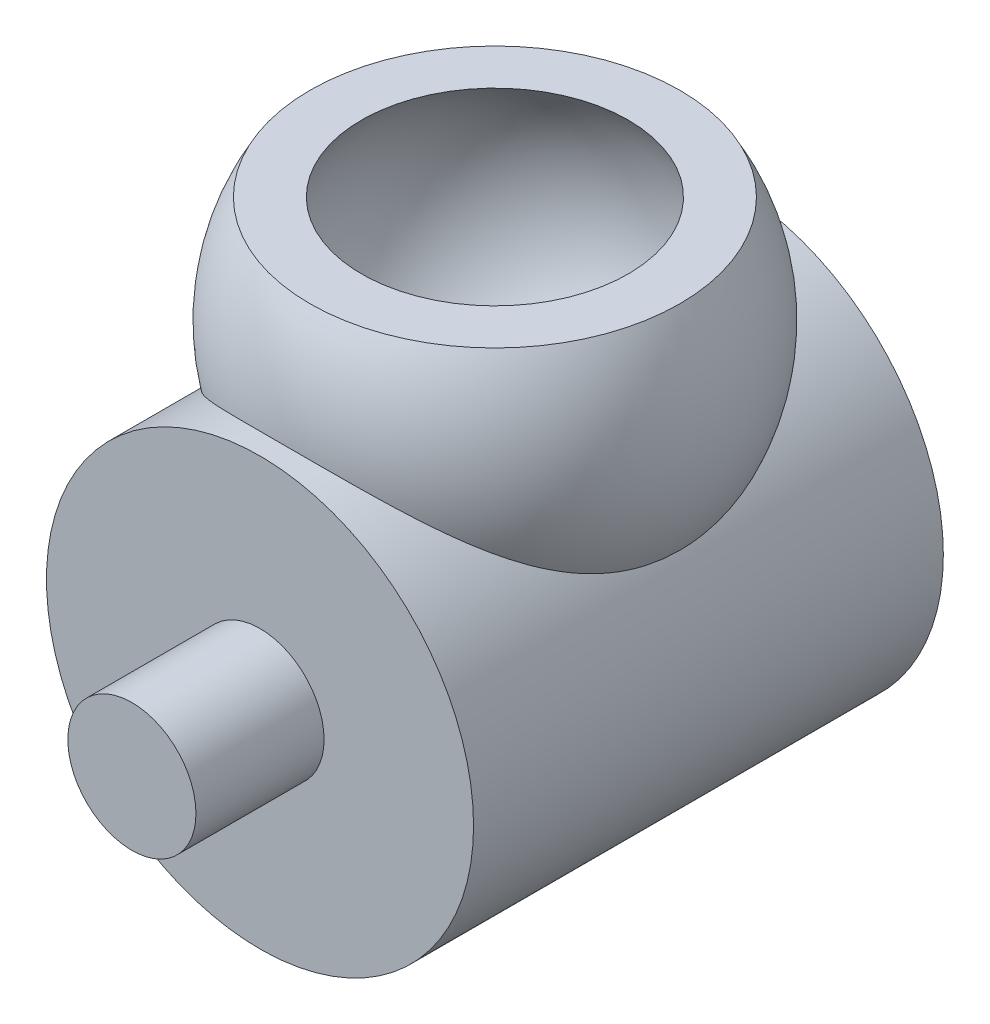
ISO-10303-21;
HEADER;
FILE_DESCRIPTION(('STEP AP214'),'2;1');
FILE_NAME('part.step','',(''),(''),'','','');
FILE_SCHEMA(('AUTOMOTIVE_DESIGN { 1 0 10303 214 1 1 1 1 }'));
ENDSEC;
DATA;
#1=APPLICATION_CONTEXT('core data for automotive mechanical design processes');
#2=APPLICATION_PROTOCOL_DEFINITION('international standard','automotive_design',2000,#1);
#3=PRODUCT_CONTEXT('',#1,'mechanical');
#4=PRODUCT('Part','Part','',(#3));
#5=PRODUCT_RELATED_PRODUCT_CATEGORY('part','',(#4));
#6=PRODUCT_DEFINITION_FORMATION('','',#4);
#7=PRODUCT_DEFINITION_CONTEXT('part definition',#1,'design');
#8=PRODUCT_DEFINITION('design','',#6,#7);
#9=PRODUCT_DEFINITION_SHAPE('','',#8);
#10=(LENGTH_UNIT() NAMED_UNIT(*) SI_UNIT(.MILLI.,.METRE.));
#11=(NAMED_UNIT(*) PLANE_ANGLE_UNIT() SI_UNIT($,.RADIAN.));
#12=(NAMED_UNIT(*) SI_UNIT($,.STERADIAN.) SOLID_ANGLE_UNIT());
#13=UNCERTAINTY_MEASURE_WITH_UNIT(LENGTH_MEASURE(1.E-05),#10,'distance_accuracy_value','');
#14=(GEOMETRIC_REPRESENTATION_CONTEXT(3) GLOBAL_UNCERTAINTY_ASSIGNED_CONTEXT((#13)) GLOBAL_UNIT_ASSIGNED_CONTEXT((#10,
#11,#12)) REPRESENTATION_CONTEXT('',''));
#15=CARTESIAN_POINT('',(0.,0.,0.));
#16=DIRECTION('',(0.,0.,1.));
#17=DIRECTION('',(1.,0.,0.));
#18=AXIS2_PLACEMENT_3D('',#15,#16,#17);
#19=CARTESIAN_POINT('',(0.,0.,22.));
#20=DIRECTION('',(0.,0.,-1.));
#21=DIRECTION('',(-1.,0.,0.));
#22=AXIS2_PLACEMENT_3D('',#19,#20,#21);
#23=CYLINDRICAL_SURFACE('',#22,10.);
#24=CARTESIAN_POINT('',(8.66025403784439,5.,11.));
#25=CARTESIAN_POINT('',(8.66025446663559,5.00000356154711,11.2602996649694));
#26=CARTESIAN_POINT('',(8.65439332849121,5.01019366703355,11.5206347078595));
#27=CARTESIAN_POINT('',(8.63085235277191,5.05063541233448,12.0392252892334));
#28=CARTESIAN_POINT('',(8.61317031103046,5.08089079358124,12.2974804308009));
#29=CARTESIAN_POINT('',(8.56568487930147,5.16054144704899,12.8101375780572));
#30=CARTESIAN_POINT('',(8.53586989915185,5.20995501826482,13.064535657533));
#31=CARTESIAN_POINT('',(8.46368322118197,5.32641977166498,13.5674176670841));
#32=CARTESIAN_POINT('',(8.42131183977671,5.3934705093968,13.8159017460188));
#33=CARTESIAN_POINT('',(8.32368665260696,5.5429377574647,14.3042560861737));
#34=CARTESIAN_POINT('',(8.26849487308933,5.62527991363019,14.5441615995003));
#35=CARTESIAN_POINT('',(8.14446494524172,5.80340111280225,15.0154178254349));
#36=CARTESIAN_POINT('',(8.07562050556833,5.89918634460234,15.2467645354858));
#37=CARTESIAN_POINT('',(7.92362558671391,6.10181879980059,15.699754663678));
#38=CARTESIAN_POINT('',(7.84047244061821,6.2086680838805,15.9213962632633));
#39=CARTESIAN_POINT('',(7.65925800920777,6.43088712942709,16.3539240982532));
#40=CARTESIAN_POINT('',(7.56120258639401,6.54625353115348,16.5648145197536));
#41=CARTESIAN_POINT('',(7.34266495109629,6.79071907568826,16.9885002858242));
#42=CARTESIAN_POINT('',(7.22113777366883,6.92022322346924,17.2005244531506));
#43=CARTESIAN_POINT('',(6.95987882367954,7.18292423608905,17.6106385847096));
#44=CARTESIAN_POINT('',(6.82014618083142,7.31612127722162,17.8087278821081));
#45=CARTESIAN_POINT('',(6.5220674927154,7.58305099372029,18.1900895956496));
#46=CARTESIAN_POINT('',(6.36371792795101,7.7167837657347,18.3733591990668));
#47=CARTESIAN_POINT('',(6.0283208736714,7.98154016838255,18.7240895048044));
#48=CARTESIAN_POINT('',(5.85127421000887,8.11256391836833,18.8915509047565));
#49=CARTESIAN_POINT('',(5.48146797292856,8.3667857626048,19.2073308151983));
#50=CARTESIAN_POINT('',(5.28897895478996,8.4900708306884,19.3558954338829));
#51=CARTESIAN_POINT('',(4.8866955201957,8.72781664073315,19.6357348251272));
#52=CARTESIAN_POINT('',(4.67690061641202,8.84227713402148,19.7670091105263));
#53=CARTESIAN_POINT('',(4.24131535517927,9.05927095386153,20.011121373804));
#54=CARTESIAN_POINT('',(4.01554021729043,9.16181538971152,20.1239765641075));
#55=CARTESIAN_POINT('',(3.54945206305906,9.35225741496778,20.3303701381697));
#56=CARTESIAN_POINT('',(3.30914214912419,9.44015811510561,20.4239126254899));
#57=CARTESIAN_POINT('',(2.85191074111843,9.5872648865897,20.5786416516524));
#58=CARTESIAN_POINT('',(2.6366502496795,9.64878355357513,20.6425530504961));
#59=CARTESIAN_POINT('',(2.19871737947692,9.7578962215817,20.755054817662));
#60=CARTESIAN_POINT('',(1.97604572638246,9.80549158147199,20.8036466811567));
#61=CARTESIAN_POINT('',(1.52533145028788,9.88563225349128,20.8850544795985));
#62=CARTESIAN_POINT('',(1.29729254787598,9.9181876861458,20.9178810237853));
#63=CARTESIAN_POINT('',(0.837791908901027,9.96752111102857,20.9674993322746));
#64=CARTESIAN_POINT('',(0.606330496802966,9.98430058925047,20.9842926068105));
#65=CARTESIAN_POINT('',(0.169976119311638,10.0006465530614,21.0006489618744));
#66=CARTESIAN_POINT('',(-0.0347846035672896,10.0020312228941,21.0020320860874));
#67=CARTESIAN_POINT('',(-0.44370215654382,9.99224421837568,20.9922425361657));
#68=CARTESIAN_POINT('',(-0.647859014572299,9.9810731341746,20.9810704521554));
#69=CARTESIAN_POINT('',(-1.05399315310657,9.94638779790189,20.9462584527401));
#70=CARTESIAN_POINT('',(-1.25597095352686,9.92287655972595,20.9226215816638));
#71=CARTESIAN_POINT('',(-1.65634358316409,9.86394794648027,20.8630545567136));
#72=CARTESIAN_POINT('',(-1.8547383538502,9.82853037709887,20.8271242022095));
#73=CARTESIAN_POINT('',(-2.24239035711663,9.74731071295485,20.7441211471241));
#74=CARTESIAN_POINT('',(-2.43175225597479,9.70174669899415,20.6973029554364));
#75=CARTESIAN_POINT('',(-2.80458571578187,9.60060457346743,20.5924365684679));
#76=CARTESIAN_POINT('',(-2.98805743789926,9.54502673617778,20.5343886807627));
#77=CARTESIAN_POINT('',(-3.34812254497823,9.42476037979004,20.40740333157));
#78=CARTESIAN_POINT('',(-3.52471541628701,9.36007118199318,20.3384650588188));
#79=CARTESIAN_POINT('',(-3.87017223245513,9.22259914991086,20.1900754471537));
#80=CARTESIAN_POINT('',(-4.03903538394848,9.14981548744022,20.1106230323271));
#81=CARTESIAN_POINT('',(-4.37957943724498,8.99204433453807,19.935828867493));
#82=CARTESIAN_POINT('',(-4.55066447549706,8.90656278485478,19.8397723665606));
#83=CARTESIAN_POINT('',(-4.88255032311383,8.72903923390047,19.6366140090996));
#84=CARTESIAN_POINT('',(-5.0433507686906,8.63699700080734,19.5295117622092));
#85=CARTESIAN_POINT('',(-5.35424304625927,8.4477928094797,19.3047269319311));
#86=CARTESIAN_POINT('',(-5.50433222503728,8.35062959305231,19.1870417433193));
#87=CARTESIAN_POINT('',(-5.79347997561854,8.15268642164282,18.9415862389164));
#88=CARTESIAN_POINT('',(-5.9325374287109,8.05190610135689,18.8138149029185));
#89=CARTESIAN_POINT('',(-6.21679365589888,7.83501389288212,18.5314480419085));
#90=CARTESIAN_POINT('',(-6.36044959110332,7.71860888335742,18.3755228282064));
#91=CARTESIAN_POINT('',(-6.63349738469536,7.48525056061556,18.052033366773));
#92=CARTESIAN_POINT('',(-6.76288820156723,7.36829720801216,17.884468270652));
#93=CARTESIAN_POINT('',(-7.00766233380284,7.13590694037059,17.538205307103));
#94=CARTESIAN_POINT('',(-7.12303640979955,7.02047106982804,17.3595002127165));
#95=CARTESIAN_POINT('',(-7.33999909801546,6.79331204353028,16.9916667172627));
#96=CARTESIAN_POINT('',(-7.44158704561165,6.68158906696794,16.8025378142861));
#97=CARTESIAN_POINT('',(-7.64392455827114,6.44958386464197,16.388868212955));
#98=CARTESIAN_POINT('',(-7.74279565029132,6.33011676723697,16.1629473532176));
#99=CARTESIAN_POINT('',(-7.92413143022233,6.10159252224175,15.6995255403739));
#100=CARTESIAN_POINT('',(-8.00659468815626,5.99253628240993,15.4620235801945));
#101=CARTESIAN_POINT('',(-8.15588297889035,5.78771480414893,14.976580774918));
#102=CARTESIAN_POINT('',(-8.22270789367514,5.69194966602379,14.7286398510595));
#103=CARTESIAN_POINT('',(-8.34148303578661,5.51642126174531,14.2236861707793));
#104=CARTESIAN_POINT('',(-8.39343378393969,5.43665743532731,13.9666737323553));
#105=CARTESIAN_POINT('',(-8.48348598169344,5.29505164583151,13.4433508861853));
#106=CARTESIAN_POINT('',(-8.52148661882316,5.2333407707225,13.17698747169));
#107=CARTESIAN_POINT('',(-8.58371184473823,5.13064425126827,12.6386908285904));
#108=CARTESIAN_POINT('',(-8.60793636243372,5.08965871387355,12.3667575712512));
#109=CARTESIAN_POINT('',(-8.64301160828297,5.02986667523719,11.8197957924354));
#110=CARTESIAN_POINT('',(-8.6538718914634,5.01104432839506,11.5447696244373));
#111=CARTESIAN_POINT('',(-8.66244583654875,4.99621005936668,10.9939098216085));
#112=CARTESIAN_POINT('',(-8.66016065800406,5.0001961252689,10.7180762601425));
#113=CARTESIAN_POINT('',(-8.64328513507224,5.02929901903323,10.1953976070272));
#114=CARTESIAN_POINT('',(-8.62993713097856,5.05228185840217,9.94838958539105));
#115=CARTESIAN_POINT('',(-8.59234665257199,5.11595010606672,9.45752510657545));
#116=CARTESIAN_POINT('',(-8.56810495641008,5.15663424992792,9.21366842557125));
#117=CARTESIAN_POINT('',(-8.50838898735113,5.25457867573233,8.73065443759649));
#118=CARTESIAN_POINT('',(-8.47291176282808,5.31184331310963,8.49149838305646));
#119=CARTESIAN_POINT('',(-8.39028128107934,5.44142225449095,8.01936482614879));
#120=CARTESIAN_POINT('',(-8.34312748297499,5.51373725562855,7.78638761054905));
#121=CARTESIAN_POINT('',(-8.23560892351489,5.67310779261729,7.32348748929042));
#122=CARTESIAN_POINT('',(-8.17501049534199,5.76041695791357,7.0937063879117));
#123=CARTESIAN_POINT('',(-8.0405150851099,5.94670609391536,6.64282448027378));
#124=CARTESIAN_POINT('',(-7.96661234790479,6.04569110891754,6.42172748118317));
#125=CARTESIAN_POINT('',(-7.80487781061184,6.25309331018571,5.98914446839023));
#126=CARTESIAN_POINT('',(-7.71704017199869,6.36151444141645,5.77766253126078));
#127=CARTESIAN_POINT('',(-7.52691433308531,6.58537132513282,5.36529226014919));
#128=CARTESIAN_POINT('',(-7.42463147319375,6.70080447632204,5.16440004866177));
#129=CARTESIAN_POINT('',(-7.19401083297101,6.94820859638759,4.75417167685175));
#130=CARTESIAN_POINT('',(-7.06408655502116,7.0806744172823,4.54602215359481));
#131=CARTESIAN_POINT('',(-6.78554255341399,7.34803909290806,4.144261831079));
#132=CARTESIAN_POINT('',(-6.63692143354957,7.48293812869696,3.95065211932255));
#133=CARTESIAN_POINT('',(-6.32068109119376,7.7519080103084,3.57890056479852));
#134=CARTESIAN_POINT('',(-6.15305930878571,7.88597874196338,3.40076081198742));
#135=CARTESIAN_POINT('',(-5.7988700158799,8.14996168636366,3.06097618550176));
#136=CARTESIAN_POINT('',(-5.61230391938765,8.27987420852756,2.89933008254251));
#137=CARTESIAN_POINT('',(-5.22746969052783,8.52784348465468,2.59889014082033));
#138=CARTESIAN_POINT('',(-5.02983554700836,8.64615558327402,2.45949641854712));
#139=CARTESIAN_POINT('',(-4.61809111493649,8.87290578214714,2.19799930384218));
#140=CARTESIAN_POINT('',(-4.40398058040739,8.98134373493662,2.07589616961968));
#141=CARTESIAN_POINT('',(-3.96077606541214,9.18540738685319,1.85008809305405));
#142=CARTESIAN_POINT('',(-3.73169732436946,9.28104582401022,1.74636482530824));
#143=CARTESIAN_POINT('',(-3.26014920575408,9.45699255031385,1.55814012920742));
#144=CARTESIAN_POINT('',(-3.01768267022728,9.53730407714481,1.47363464052949));
#145=CARTESIAN_POINT('',(-2.55871207760877,9.66960342508527,1.33583573958133));
#146=CARTESIAN_POINT('',(-2.3437387891068,9.72403000408985,1.27976574123799));
#147=CARTESIAN_POINT('',(-1.90742000524765,9.81893929205379,1.18260973974487));
#148=CARTESIAN_POINT('',(-1.68607518289569,9.85942346789198,1.14152216026955));
#149=CARTESIAN_POINT('',(-1.23902743281227,9.92551460883601,1.07470865717468));
#150=CARTESIAN_POINT('',(-1.01332723702795,9.95113060558894,1.04897340754709));
#151=CARTESIAN_POINT('',(-0.559480585975828,9.98693037220869,1.0130618234957));
#152=CARTESIAN_POINT('',(-0.331334321885468,9.99711533939119,1.00288428192652));
#153=CARTESIAN_POINT('',(0.100014707442284,10.0015626801407,0.998437683316685));
#154=CARTESIAN_POINT('',(0.303187272772701,9.99746053287599,1.00253461585224));
#155=CARTESIAN_POINT('',(0.708280891447901,9.97694639582573,1.02307485111526));
#156=CARTESIAN_POINT('',(0.910201987449435,9.96053482796348,1.03951773066748));
#157=CARTESIAN_POINT('',(1.31127730510857,9.9157080200347,1.08462470492346));
#158=CARTESIAN_POINT('',(1.51043210559974,9.88729533144829,1.11328620191853));
#159=CARTESIAN_POINT('',(1.90463488515505,9.81898076142958,1.18262681799326));
#160=CARTESIAN_POINT('',(2.09968277336051,9.77907862609817,1.22330620265025));
#161=CARTESIAN_POINT('',(2.48231086562395,9.68898082390574,1.31590300405287));
#162=CARTESIAN_POINT('',(2.66994893925415,9.63890087507525,1.36769442066353));
#163=CARTESIAN_POINT('',(3.03884613260834,9.52903221191736,1.4824407369595));
#164=CARTESIAN_POINT('',(3.22010537713412,9.46924368766686,1.54539541808986));
#165=CARTESIAN_POINT('',(3.5753173852315,9.34091924308975,1.68211094814011));
#166=CARTESIAN_POINT('',(3.74926935613782,9.27238237701624,1.75587296552388));
#167=CARTESIAN_POINT('',(4.08906972504392,9.12762959173802,1.91381119554677));
#168=CARTESIAN_POINT('',(4.25491726192157,9.05141285914591,1.99798851150308));
#169=CARTESIAN_POINT('',(4.5902042177424,8.88636890314338,2.18316425146493));
#170=CARTESIAN_POINT('',(4.75894993017943,8.79702310866914,2.28495648321512));
#171=CARTESIAN_POINT('',(5.08570892784206,8.61224717959875,2.49961986437941));
#172=CARTESIAN_POINT('',(5.24372177600022,8.51681679753032,2.61249146451431));
#173=CARTESIAN_POINT('',(5.54864961017844,8.32137550186668,2.8488359165273));
#174=CARTESIAN_POINT('',(5.69556202776055,8.22136353672287,2.97231120787202));
#175=CARTESIAN_POINT('',(5.97803082700156,8.01831718253488,3.22935885597398));
#176=CARTESIAN_POINT('',(6.11358612917619,7.91528250743848,3.36293217024959));
#177=CARTESIAN_POINT('',(6.39061956786394,7.69386007548534,3.65821457496927));
#178=CARTESIAN_POINT('',(6.53046658176794,7.57526137159566,3.82129773827914));
#179=CARTESIAN_POINT('',(6.79553481326041,7.33841311934736,4.15918088479453));
#180=CARTESIAN_POINT('',(6.92075487703829,7.2201635992494,4.33398179061557));
#181=CARTESIAN_POINT('',(7.15692184108605,6.98613846155804,4.69481616606408));
#182=CARTESIAN_POINT('',(7.26785613830833,6.87036510252319,4.88085934404291));
#183=CARTESIAN_POINT('',(7.47571039279739,6.64359974674127,5.26339968512536));
#184=CARTESIAN_POINT('',(7.57262953604399,6.53260802798136,5.45989745454061));
#185=CARTESIAN_POINT('',(7.76431313503894,6.30399992143599,5.88810929155325));
#186=CARTESIAN_POINT('',(7.85726177052679,6.18731546195672,6.12113797218631));
#187=CARTESIAN_POINT('',(8.02671489273926,5.96584401868983,6.59843212188624));
#188=CARTESIAN_POINT('',(8.10322589793578,5.8610523265376,6.84269308987557));
#189=CARTESIAN_POINT('',(8.24059749080127,5.6662820154818,7.34108187936723));
#190=CARTESIAN_POINT('',(8.30147084294886,5.57629133674642,7.59520145732751));
#191=CARTESIAN_POINT('',(8.40840357518543,5.41370852370559,8.11194589386707));
#192=CARTESIAN_POINT('',(8.45446722598786,5.34111137512239,8.37456827638087));
#193=CARTESIAN_POINT('',(8.52159686364049,5.23308775975548,8.83237222988142));
#194=CARTESIAN_POINT('',(8.54605185316872,5.19294028486677,9.02596097311928));
#195=CARTESIAN_POINT('',(8.58781608977103,5.12357895943004,9.41584148063042));
#196=CARTESIAN_POINT('',(8.60512619390402,5.09436379754462,9.61213291778355));
#197=CARTESIAN_POINT('',(8.63275688272403,5.04740069569507,10.0065691735572));
#198=CARTESIAN_POINT('',(8.64307766120829,5.02965243778182,10.204713940635));
#199=CARTESIAN_POINT('',(8.65682540318788,5.0059518773202,10.6018990299189));
#200=CARTESIAN_POINT('',(8.66025370993181,4.99999727635253,10.8009391700496));
#201=CARTESIAN_POINT('',(8.66025403784439,5.,11.));
#202=B_SPLINE_CURVE_WITH_KNOTS('',3,(#24,#25,#26,#27,#28,#29,#30,#31,#32,#33,#34,#35,#36,#37,
#38,#39,#40,#41,#42,#43,#44,#45,#46,#47,#48,#49,#50,#51,#52,#53,#54,#55,#56,#57,#58,#59,#60,#61,
#62,#63,#64,#65,#66,#67,#68,#69,#70,#71,#72,#73,#74,#75,#76,#77,#78,#79,#80,#81,#82,#83,#84,#85,
#86,#87,#88,#89,#90,#91,#92,#93,#94,#95,#96,#97,#98,#99,#100,#101,#102,#103,#104,#105,#106,#107,
#108,#109,#110,#111,#112,#113,#114,#115,#116,#117,#118,#119,#120,#121,#122,#123,#124,#125,#126,
#127,#128,#129,#130,#131,#132,#133,#134,#135,#136,#137,#138,#139,#140,#141,#142,#143,#144,#145,
#146,#147,#148,#149,#150,#151,#152,#153,#154,#155,#156,#157,#158,#159,#160,#161,#162,#163,#164,
#165,#166,#167,#168,#169,#170,#171,#172,#173,#174,#175,#176,#177,#178,#179,#180,#181,#182,#183,
#184,#185,#186,#187,#188,#189,#190,#191,#192,#193,#194,#195,#196,#197,#198,#199,#200,#201),
.UNSPECIFIED.,.T.,.F.,(4,2,2,2,2,2,2,2,2,2,2,2,2,2,2,2,2,2,2,2,2,2,2,2,2,2,2,2,2,2,2,2,2,2,2,2,
2,2,2,2,2,2,2,2,2,2,2,2,2,2,2,2,2,2,2,2,2,2,2,2,2,2,2,2,2,2,2,2,2,2,2,2,2,2,2,2,2,2,2,2,2,2,2,2,
2,2,2,2,4),(0.,0.780697660586607,1.56154093337428,2.34313187536267,3.12470312332698,
3.9025690427291,4.68079425044133,5.45916466434169,6.23722965903006,7.06599026839827,
7.8947905100314,8.7237476876089,9.55266826536943,10.3693515301896,11.1860578003966,
12.0019964434977,12.8177615371997,13.5152440826969,14.2126585334548,14.9096030006465,
15.6064818135639,16.2200389096845,16.8335671683781,17.4469456517678,18.0603341459981,
18.6606150895832,19.2608795941076,19.8611888355798,20.4615595543004,21.1029530189365,
21.7443691584908,22.3859436312785,23.0275830822333,23.7524459833021,24.4773617726009,
25.2027528389544,25.9281788636691,26.7493017801716,27.5704962279303,28.391696872665,
29.2128687591301,30.0398632879151,30.8668620842581,31.6932692570904,32.5196035343417,
33.2640185465326,34.0083803926156,34.7529379484834,35.4975299999719,36.2562485045868,
37.0152960059274,37.7746623814072,38.5337487499434,39.3692703084819,40.2048542975839,
41.0405509971475,41.8761853660126,42.6827119435599,43.4892505641123,44.2949804551024,
45.1005399533929,45.7857900729317,46.4709680753339,47.155729430895,47.84043765212,
48.4494659037023,49.0584732809101,49.6673512461437,50.2762426676759,50.8785638639115,
51.4808732691744,52.0832478428387,52.685686282185,53.334153257879,53.982646624859,
54.6312895848219,55.2799941279733,56.0154274950107,56.7509188357598,57.4870546529455,
58.2232332087936,59.0523263977871,59.8810901939681,60.7091753336389,61.5370214615326,
62.1342545901971,62.7314160574139,63.3285609660978,63.9255894881092),.UNSPECIFIED.);
#203=CARTESIAN_POINT('',(8.66025403784439,5.,11.));
#204=VERTEX_POINT('',#203);
#205=EDGE_CURVE('E48',#204,#204,#202,.T.);
#206=ORIENTED_EDGE('',*,*,#205,.T.);
#207=EDGE_LOOP('',(#206));
#208=FACE_BOUND('',#207,.T.);
#209=CARTESIAN_POINT('',(0.,0.,22.));
#210=DIRECTION('',(0.,0.,1.));
#211=DIRECTION('',(1.,0.,0.));
#212=AXIS2_PLACEMENT_3D('',#209,#210,#211);
#213=CIRCLE('',#212,10.);
#214=CARTESIAN_POINT('',(10.,0.,22.));
#215=VERTEX_POINT('',#214);
#216=EDGE_CURVE('E39',#215,#215,#213,.T.);
#217=ORIENTED_EDGE('',*,*,#216,.F.);
#218=EDGE_LOOP('',(#217));
#219=FACE_BOUND('',#218,.T.);
#220=CARTESIAN_POINT('',(0.,0.,0.));
#221=DIRECTION('',(0.,0.,1.));
#222=DIRECTION('',(1.,0.,0.));
#223=AXIS2_PLACEMENT_3D('',#220,#221,#222);
#224=CIRCLE('',#223,10.);
#225=CARTESIAN_POINT('',(10.,0.,0.));
#226=VERTEX_POINT('',#225);
#227=EDGE_CURVE('E35',#226,#226,#224,.T.);
#228=ORIENTED_EDGE('',*,*,#227,.T.);
#229=EDGE_LOOP('',(#228));
#230=FACE_BOUND('',#229,.T.);
#231=ADVANCED_FACE('F31',(#208,#219,#230),#23,.T.);
#232=CARTESIAN_POINT('',(0.,0.,22.));
#233=DIRECTION('',(0.,0.,1.));
#234=DIRECTION('',(1.,0.,0.));
#235=AXIS2_PLACEMENT_3D('',#232,#233,#234);
#236=PLANE('',#235);
#237=CARTESIAN_POINT('',(0.,0.,22.));
#238=DIRECTION('',(0.,0.,1.));
#239=DIRECTION('',(1.,0.,0.));
#240=AXIS2_PLACEMENT_3D('',#237,#238,#239);
#241=CIRCLE('',#240,3.);
#242=CARTESIAN_POINT('',(3.,0.,22.));
#243=VERTEX_POINT('',#242);
#244=EDGE_CURVE('E10',#243,#243,#241,.T.);
#245=ORIENTED_EDGE('',*,*,#244,.F.);
#246=EDGE_LOOP('',(#245));
#247=FACE_BOUND('',#246,.T.);
#248=ORIENTED_EDGE('',*,*,#216,.T.);
#249=EDGE_LOOP('',(#248));
#250=FACE_BOUND('',#249,.T.);
#251=ADVANCED_FACE('F74',(#247,#250),#236,.T.);
#252=CARTESIAN_POINT('',(0.,0.,0.));
#253=DIRECTION('',(0.,0.,1.));
#254=DIRECTION('',(1.,0.,0.));
#255=AXIS2_PLACEMENT_3D('',#252,#253,#254);
#256=PLANE('',#255);
#257=ORIENTED_EDGE('',*,*,#227,.F.);
#258=EDGE_LOOP('',(#257));
#259=FACE_BOUND('',#258,.T.);
#260=ADVANCED_FACE('F72',(#259),#256,.F.);
#261=CARTESIAN_POINT('',(0.,0.,28.));
#262=DIRECTION('',(0.,0.,-1.));
#263=DIRECTION('',(-1.,0.,0.));
#264=AXIS2_PLACEMENT_3D('',#261,#262,#263);
#265=CYLINDRICAL_SURFACE('',#264,3.);
#266=CARTESIAN_POINT('',(0.,0.,28.));
#267=DIRECTION('',(0.,0.,1.));
#268=DIRECTION('',(1.,0.,0.));
#269=AXIS2_PLACEMENT_3D('',#266,#267,#268);
#270=CIRCLE('',#269,3.);
#271=CARTESIAN_POINT('',(3.,0.,28.));
#272=VERTEX_POINT('',#271);
#273=EDGE_CURVE('E45',#272,#272,#270,.T.);
#274=ORIENTED_EDGE('',*,*,#273,.F.);
#275=EDGE_LOOP('',(#274));
#276=FACE_BOUND('',#275,.T.);
#277=ORIENTED_EDGE('',*,*,#244,.T.);
#278=EDGE_LOOP('',(#277));
#279=FACE_BOUND('',#278,.T.);
#280=ADVANCED_FACE('F68',(#276,#279),#265,.T.);
#281=CARTESIAN_POINT('',(0.,0.,28.));
#282=DIRECTION('',(0.,0.,1.));
#283=DIRECTION('',(1.,0.,0.));
#284=AXIS2_PLACEMENT_3D('',#281,#282,#283);
#285=PLANE('',#284);
#286=ORIENTED_EDGE('',*,*,#273,.T.);
#287=EDGE_LOOP('',(#286));
#288=FACE_BOUND('',#287,.T.);
#289=ADVANCED_FACE('F63',(#288),#285,.T.);
#290=CARTESIAN_POINT('',(0.,10.,11.));
#291=DIRECTION('',(0.,-1.,0.));
#292=DIRECTION('',(0.,0.,1.));
#293=AXIS2_PLACEMENT_3D('',#290,#291,#292);
#294=SPHERICAL_SURFACE('',#293,10.);
#295=CARTESIAN_POINT('',(0.,15.,11.));
#296=DIRECTION('',(0.,-1.,0.));
#297=DIRECTION('',(0.,0.,-1.));
#298=AXIS2_PLACEMENT_3D('',#295,#296,#297);
#299=CIRCLE('',#298,8.66025403784436);
#300=CARTESIAN_POINT('',(0.,15.,2.33974596215564));
#301=VERTEX_POINT('',#300);
#302=EDGE_CURVE('E143',#301,#301,#299,.T.);
#303=ORIENTED_EDGE('',*,*,#302,.T.);
#304=EDGE_LOOP('',(#303));
#305=FACE_BOUND('',#304,.T.);
#306=ORIENTED_EDGE('',*,*,#205,.F.);
#307=EDGE_LOOP('',(#306));
#308=FACE_BOUND('',#307,.T.);
#309=ADVANCED_FACE('F57',(#305,#308),#294,.T.);
#310=CARTESIAN_POINT('',(0.,10.,11.));
#311=DIRECTION('',(0.,-1.,0.));
#312=DIRECTION('',(0.,0.,-1.));
#313=AXIS2_PLACEMENT_3D('',#310,#311,#312);
#314=SPHERICAL_SURFACE('',#313,8.);
#315=CARTESIAN_POINT('',(0.,15.,11.));
#316=DIRECTION('',(0.,-1.,0.));
#317=DIRECTION('',(0.,0.,-1.));
#318=AXIS2_PLACEMENT_3D('',#315,#316,#317);
#319=CIRCLE('',#318,6.24499799839837);
#320=CARTESIAN_POINT('',(0.,15.,4.75500200160163));
#321=VERTEX_POINT('',#320);
#322=EDGE_CURVE('E55',#321,#321,#319,.T.);
#323=ORIENTED_EDGE('',*,*,#322,.F.);
#324=EDGE_LOOP('',(#323));
#325=FACE_BOUND('',#324,.T.);
#326=ADVANCED_FACE('F62',(#325),#314,.F.);
#327=CARTESIAN_POINT('',(0.,15.,4.75500200160163));
#328=DIRECTION('',(0.,1.,0.));
#329=DIRECTION('',(0.,0.,1.));
#330=AXIS2_PLACEMENT_3D('',#327,#328,#329);
#331=PLANE('',#330);
#332=ORIENTED_EDGE('',*,*,#322,.T.);
#333=EDGE_LOOP('',(#332));
#334=FACE_BOUND('',#333,.T.);
#335=ORIENTED_EDGE('',*,*,#302,.F.);
#336=EDGE_LOOP('',(#335));
#337=FACE_BOUND('',#336,.T.);
#338=ADVANCED_FACE('F123',(#334,#337),#331,.T.);
#339=CLOSED_SHELL('',(#231,#251,#260,#280,#289,#309,#326,#338));
#340=MANIFOLD_SOLID_BREP('B2',#339);
#341=ADVANCED_BREP_SHAPE_REPRESENTATION('',(#18,#340),#14);
#342=SHAPE_DEFINITION_REPRESENTATION(#9,#341);
ENDSEC;
END-ISO-10303-21;
